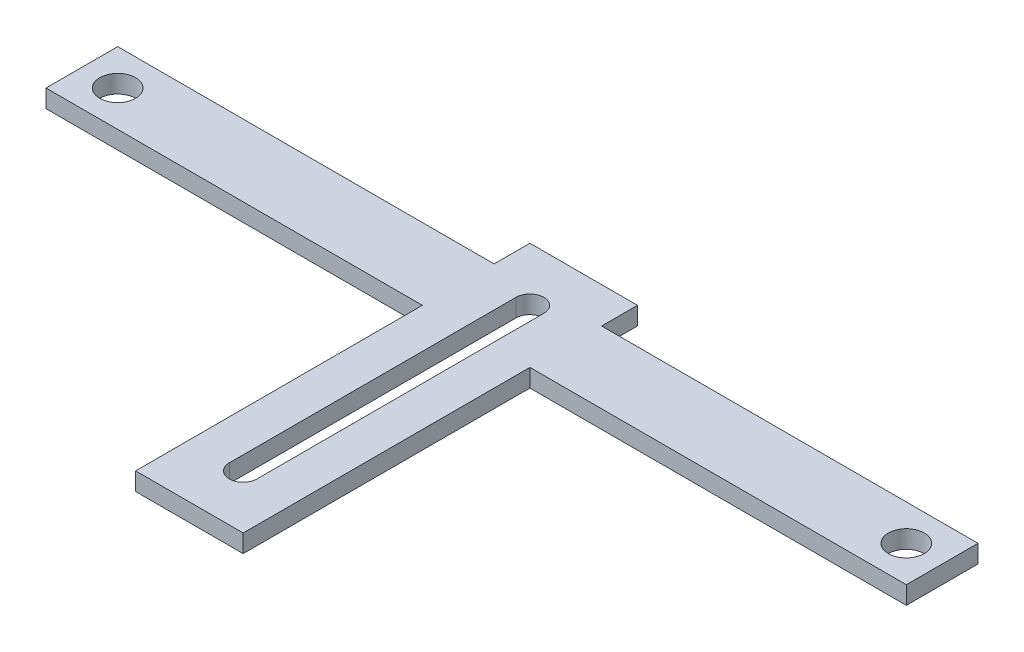
ISO-10303-21;
HEADER;
FILE_DESCRIPTION(('STEP AP214'),'2;1');
FILE_NAME('part.step','',(''),(''),'','','');
FILE_SCHEMA(('AUTOMOTIVE_DESIGN { 1 0 10303 214 1 1 1 1 }'));
ENDSEC;
DATA;
#1=APPLICATION_CONTEXT('core data for automotive mechanical design processes');
#2=APPLICATION_PROTOCOL_DEFINITION('international standard','automotive_design',2000,#1);
#3=PRODUCT_CONTEXT('',#1,'mechanical');
#4=PRODUCT('Part','Part','',(#3));
#5=PRODUCT_RELATED_PRODUCT_CATEGORY('part','',(#4));
#6=PRODUCT_DEFINITION_FORMATION('','',#4);
#7=PRODUCT_DEFINITION_CONTEXT('part definition',#1,'design');
#8=PRODUCT_DEFINITION('design','',#6,#7);
#9=PRODUCT_DEFINITION_SHAPE('','',#8);
#10=(LENGTH_UNIT() NAMED_UNIT(*) SI_UNIT(.MILLI.,.METRE.));
#11=(NAMED_UNIT(*) PLANE_ANGLE_UNIT() SI_UNIT($,.RADIAN.));
#12=(NAMED_UNIT(*) SI_UNIT($,.STERADIAN.) SOLID_ANGLE_UNIT());
#13=UNCERTAINTY_MEASURE_WITH_UNIT(LENGTH_MEASURE(1.E-05),#10,'distance_accuracy_value','');
#14=(GEOMETRIC_REPRESENTATION_CONTEXT(3) GLOBAL_UNCERTAINTY_ASSIGNED_CONTEXT((#13)) GLOBAL_UNIT_ASSIGNED_CONTEXT((#10,
#11,#12)) REPRESENTATION_CONTEXT('',''));
#15=CARTESIAN_POINT('',(0.,0.,0.));
#16=DIRECTION('',(0.,0.,1.));
#17=DIRECTION('',(1.,0.,0.));
#18=AXIS2_PLACEMENT_3D('',#15,#16,#17);
#19=CARTESIAN_POINT('',(-152.4,6.35,-12.7));
#20=DIRECTION('',(0.,0.,1.));
#21=DIRECTION('',(1.,0.,0.));
#22=AXIS2_PLACEMENT_3D('',#19,#20,#21);
#23=PLANE('',#22);
#24=DIRECTION('',(-1.,0.,0.));
#25=VECTOR('',#24,1.);
#26=CARTESIAN_POINT('',(-152.4,6.35,-12.7));
#27=LINE('',#26,#25);
#28=CARTESIAN_POINT('',(-19.0499999999999,6.35,-12.7));
#29=VERTEX_POINT('',#28);
#30=CARTESIAN_POINT('',(-152.4,6.35,-12.7));
#31=VERTEX_POINT('',#30);
#32=EDGE_CURVE('E238',#29,#31,#27,.T.);
#33=ORIENTED_EDGE('',*,*,#32,.F.);
#34=DIRECTION('',(0.,-1.,0.));
#35=VECTOR('',#34,1.);
#36=CARTESIAN_POINT('',(-19.0499999999999,6.35,-12.7));
#37=LINE('',#36,#35);
#38=CARTESIAN_POINT('',(-19.0499999999999,0.,-12.7));
#39=VERTEX_POINT('',#38);
#40=EDGE_CURVE('E219',#29,#39,#37,.T.);
#41=ORIENTED_EDGE('',*,*,#40,.T.);
#42=DIRECTION('',(-1.,0.,0.));
#43=VECTOR('',#42,1.);
#44=CARTESIAN_POINT('',(-152.4,0.,-12.7));
#45=LINE('',#44,#43);
#46=CARTESIAN_POINT('',(-152.4,0.,-12.7));
#47=VERTEX_POINT('',#46);
#48=EDGE_CURVE('E252',#39,#47,#45,.T.);
#49=ORIENTED_EDGE('',*,*,#48,.T.);
#50=DIRECTION('',(0.,-1.,0.));
#51=VECTOR('',#50,1.);
#52=CARTESIAN_POINT('',(-152.4,6.35,-12.7));
#53=LINE('',#52,#51);
#54=EDGE_CURVE('E266',#31,#47,#53,.T.);
#55=ORIENTED_EDGE('',*,*,#54,.F.);
#56=EDGE_LOOP('',(#33,#41,#49,#55));
#57=FACE_BOUND('',#56,.T.);
#58=ADVANCED_FACE('F33',(#57),#23,.F.);
#59=CARTESIAN_POINT('',(-152.4,6.35,12.7));
#60=DIRECTION('',(0.,0.,-1.));
#61=DIRECTION('',(-1.,0.,0.));
#62=AXIS2_PLACEMENT_3D('',#59,#60,#61);
#63=PLANE('',#62);
#64=DIRECTION('',(1.,0.,0.));
#65=VECTOR('',#64,1.);
#66=CARTESIAN_POINT('',(-152.4,0.,12.7));
#67=LINE('',#66,#65);
#68=CARTESIAN_POINT('',(-152.4,0.,12.7));
#69=VERTEX_POINT('',#68);
#70=CARTESIAN_POINT('',(-19.0499999999999,0.,12.7));
#71=VERTEX_POINT('',#70);
#72=EDGE_CURVE('E239',#69,#71,#67,.T.);
#73=ORIENTED_EDGE('',*,*,#72,.T.);
#74=DIRECTION('',(0.,1.,0.));
#75=VECTOR('',#74,1.);
#76=CARTESIAN_POINT('',(-19.0499999999999,6.35,12.7));
#77=LINE('',#76,#75);
#78=CARTESIAN_POINT('',(-19.0499999999999,6.35,12.7));
#79=VERTEX_POINT('',#78);
#80=EDGE_CURVE('E11',#71,#79,#77,.T.);
#81=ORIENTED_EDGE('',*,*,#80,.T.);
#82=DIRECTION('',(1.,0.,0.));
#83=VECTOR('',#82,1.);
#84=CARTESIAN_POINT('',(-152.4,6.35,12.7));
#85=LINE('',#84,#83);
#86=CARTESIAN_POINT('',(-152.4,6.35,12.7));
#87=VERTEX_POINT('',#86);
#88=EDGE_CURVE('E246',#87,#79,#85,.T.);
#89=ORIENTED_EDGE('',*,*,#88,.F.);
#90=DIRECTION('',(0.,-1.,0.));
#91=VECTOR('',#90,1.);
#92=CARTESIAN_POINT('',(-152.4,6.35,12.7));
#93=LINE('',#92,#91);
#94=EDGE_CURVE('E263',#87,#69,#93,.T.);
#95=ORIENTED_EDGE('',*,*,#94,.T.);
#96=EDGE_LOOP('',(#73,#81,#89,#95));
#97=FACE_BOUND('',#96,.T.);
#98=ADVANCED_FACE('F300',(#97),#63,.F.);
#99=CARTESIAN_POINT('',(0.,6.35,0.));
#100=DIRECTION('',(0.,-1.,0.));
#101=DIRECTION('',(0.,0.,-1.));
#102=AXIS2_PLACEMENT_3D('',#99,#100,#101);
#103=PLANE('',#102);
#104=DIRECTION('',(0.,0.,-1.));
#105=VECTOR('',#104,1.);
#106=CARTESIAN_POINT('',(4.92294056329001,6.35,95.25));
#107=LINE('',#106,#105);
#108=CARTESIAN_POINT('',(4.92294056329001,6.35,95.25));
#109=VERTEX_POINT('',#108);
#110=CARTESIAN_POINT('',(4.92294056329001,6.35,-6.35));
#111=VERTEX_POINT('',#110);
#112=EDGE_CURVE('E165',#109,#111,#107,.T.);
#113=ORIENTED_EDGE('',*,*,#112,.F.);
#114=CARTESIAN_POINT('',(0.,6.35,95.25));
#115=DIRECTION('',(0.,1.,0.));
#116=DIRECTION('',(0.,0.,1.));
#117=AXIS2_PLACEMENT_3D('',#114,#115,#116);
#118=CIRCLE('',#117,4.92294056329001);
#119=CARTESIAN_POINT('',(-4.92294056329001,6.35,95.25));
#120=VERTEX_POINT('',#119);
#121=EDGE_CURVE('E48',#120,#109,#118,.T.);
#122=ORIENTED_EDGE('',*,*,#121,.F.);
#123=DIRECTION('',(0.,0.,1.));
#124=VECTOR('',#123,1.);
#125=CARTESIAN_POINT('',(-4.92294056329001,6.35,95.25));
#126=LINE('',#125,#124);
#127=CARTESIAN_POINT('',(-4.92294056329001,6.35,-6.35));
#128=VERTEX_POINT('',#127);
#129=EDGE_CURVE('E158',#128,#120,#126,.T.);
#130=ORIENTED_EDGE('',*,*,#129,.F.);
#131=CARTESIAN_POINT('',(0.,6.35,-6.35));
#132=DIRECTION('',(0.,1.,0.));
#133=DIRECTION('',(0.,0.,1.));
#134=AXIS2_PLACEMENT_3D('',#131,#132,#133);
#135=CIRCLE('',#134,4.92294056329001);
#136=EDGE_CURVE('E172',#111,#128,#135,.T.);
#137=ORIENTED_EDGE('',*,*,#136,.F.);
#138=EDGE_LOOP('',(#113,#122,#130,#137));
#139=FACE_BOUND('',#138,.T.);
#140=CARTESIAN_POINT('',(152.4,6.35,-12.7));
#141=VERTEX_POINT('',#140);
#142=CARTESIAN_POINT('',(19.05,6.35,-12.7));
#143=VERTEX_POINT('',#142);
#144=EDGE_CURVE('E240',#141,#143,#27,.T.);
#145=ORIENTED_EDGE('',*,*,#144,.T.);
#146=DIRECTION('',(0.,0.,-1.));
#147=VECTOR('',#146,1.);
#148=CARTESIAN_POINT('',(19.0500000000001,6.35,12.7));
#149=LINE('',#148,#147);
#150=CARTESIAN_POINT('',(19.0500000000001,6.35,-25.4));
#151=VERTEX_POINT('',#150);
#152=EDGE_CURVE('E188',#143,#151,#149,.T.);
#153=ORIENTED_EDGE('',*,*,#152,.T.);
#154=DIRECTION('',(-1.,0.,0.));
#155=VECTOR('',#154,1.);
#156=CARTESIAN_POINT('',(-19.0499999999999,6.35,-25.4));
#157=LINE('',#156,#155);
#158=CARTESIAN_POINT('',(-19.0499999999999,6.35,-25.4));
#159=VERTEX_POINT('',#158);
#160=EDGE_CURVE('E152',#151,#159,#157,.T.);
#161=ORIENTED_EDGE('',*,*,#160,.T.);
#162=DIRECTION('',(0.,0.,1.));
#163=VECTOR('',#162,1.);
#164=CARTESIAN_POINT('',(-19.0499999999999,6.35,12.7));
#165=LINE('',#164,#163);
#166=EDGE_CURVE('E192',#159,#29,#165,.T.);
#167=ORIENTED_EDGE('',*,*,#166,.T.);
#168=ORIENTED_EDGE('',*,*,#32,.T.);
#169=DIRECTION('',(0.,0.,1.));
#170=VECTOR('',#169,1.);
#171=CARTESIAN_POINT('',(-152.4,6.35,12.7));
#172=LINE('',#171,#170);
#173=EDGE_CURVE('E243',#31,#87,#172,.T.);
#174=ORIENTED_EDGE('',*,*,#173,.T.);
#175=ORIENTED_EDGE('',*,*,#88,.T.);
#176=CARTESIAN_POINT('',(-19.0499999999999,6.35,114.3));
#177=VERTEX_POINT('',#176);
#178=EDGE_CURVE('E183',#79,#177,#165,.T.);
#179=ORIENTED_EDGE('',*,*,#178,.T.);
#180=DIRECTION('',(1.,0.,0.));
#181=VECTOR('',#180,1.);
#182=CARTESIAN_POINT('',(-19.0499999999999,6.35,114.3));
#183=LINE('',#182,#181);
#184=CARTESIAN_POINT('',(19.0500000000001,6.35,114.3));
#185=VERTEX_POINT('',#184);
#186=EDGE_CURVE('E189',#177,#185,#183,.T.);
#187=ORIENTED_EDGE('',*,*,#186,.T.);
#188=CARTESIAN_POINT('',(19.0500000000001,6.35,12.7));
#189=VERTEX_POINT('',#188);
#190=EDGE_CURVE('E184',#185,#189,#149,.T.);
#191=ORIENTED_EDGE('',*,*,#190,.T.);
#192=CARTESIAN_POINT('',(152.4,6.35,12.7));
#193=VERTEX_POINT('',#192);
#194=EDGE_CURVE('E245',#189,#193,#85,.T.);
#195=ORIENTED_EDGE('',*,*,#194,.T.);
#196=DIRECTION('',(0.,0.,-1.));
#197=VECTOR('',#196,1.);
#198=CARTESIAN_POINT('',(152.4,6.35,12.7));
#199=LINE('',#198,#197);
#200=EDGE_CURVE('E235',#193,#141,#199,.T.);
#201=ORIENTED_EDGE('',*,*,#200,.T.);
#202=EDGE_LOOP('',(#145,#153,#161,#167,#168,#174,#175,#179,#187,#191,#195,#201));
#203=FACE_BOUND('',#202,.T.);
#204=CARTESIAN_POINT('',(139.7,6.35,0.));
#205=DIRECTION('',(0.,1.,0.));
#206=DIRECTION('',(0.,0.,1.));
#207=AXIS2_PLACEMENT_3D('',#204,#205,#206);
#208=CIRCLE('',#207,6.35);
#209=CARTESIAN_POINT('',(139.7,6.35,6.34999999999999));
#210=VERTEX_POINT('',#209);
#211=EDGE_CURVE('E223',#210,#210,#208,.T.);
#212=ORIENTED_EDGE('',*,*,#211,.F.);
#213=EDGE_LOOP('',(#212));
#214=FACE_BOUND('',#213,.T.);
#215=CARTESIAN_POINT('',(-139.7,6.35,0.));
#216=DIRECTION('',(0.,1.,0.));
#217=DIRECTION('',(0.,0.,1.));
#218=AXIS2_PLACEMENT_3D('',#215,#216,#217);
#219=CIRCLE('',#218,6.35);
#220=CARTESIAN_POINT('',(-139.7,6.35,6.34999999999999));
#221=VERTEX_POINT('',#220);
#222=EDGE_CURVE('E229',#221,#221,#219,.T.);
#223=ORIENTED_EDGE('',*,*,#222,.F.);
#224=EDGE_LOOP('',(#223));
#225=FACE_BOUND('',#224,.T.);
#226=ADVANCED_FACE('F288',(#139,#203,#214,#225),#103,.F.);
#227=CARTESIAN_POINT('',(0.,0.,0.));
#228=DIRECTION('',(0.,-1.,0.));
#229=DIRECTION('',(0.,0.,-1.));
#230=AXIS2_PLACEMENT_3D('',#227,#228,#229);
#231=PLANE('',#230);
#232=CARTESIAN_POINT('',(0.,0.,95.25));
#233=DIRECTION('',(0.,-1.,0.));
#234=DIRECTION('',(0.,0.,-1.));
#235=AXIS2_PLACEMENT_3D('',#232,#233,#234);
#236=CIRCLE('',#235,4.92294056329001);
#237=CARTESIAN_POINT('',(-4.92294056329001,0.,95.25));
#238=VERTEX_POINT('',#237);
#239=CARTESIAN_POINT('',(4.92294056329001,0.,95.25));
#240=VERTEX_POINT('',#239);
#241=EDGE_CURVE('E156',#238,#240,#236,.F.);
#242=ORIENTED_EDGE('',*,*,#241,.T.);
#243=DIRECTION('',(0.,0.,-1.));
#244=VECTOR('',#243,1.);
#245=CARTESIAN_POINT('',(4.92294056329001,0.,95.25));
#246=LINE('',#245,#244);
#247=CARTESIAN_POINT('',(4.92294056329001,0.,-6.35));
#248=VERTEX_POINT('',#247);
#249=EDGE_CURVE('E145',#240,#248,#246,.T.);
#250=ORIENTED_EDGE('',*,*,#249,.T.);
#251=CARTESIAN_POINT('',(0.,0.,-6.35));
#252=DIRECTION('',(0.,-1.,0.));
#253=DIRECTION('',(0.,0.,-1.));
#254=AXIS2_PLACEMENT_3D('',#251,#252,#253);
#255=CIRCLE('',#254,4.92294056329001);
#256=CARTESIAN_POINT('',(-4.92294056329001,0.,-6.35));
#257=VERTEX_POINT('',#256);
#258=EDGE_CURVE('E167',#248,#257,#255,.F.);
#259=ORIENTED_EDGE('',*,*,#258,.T.);
#260=DIRECTION('',(0.,0.,1.));
#261=VECTOR('',#260,1.);
#262=CARTESIAN_POINT('',(-4.92294056329001,0.,95.25));
#263=LINE('',#262,#261);
#264=EDGE_CURVE('E163',#257,#238,#263,.T.);
#265=ORIENTED_EDGE('',*,*,#264,.T.);
#266=EDGE_LOOP('',(#242,#250,#259,#265));
#267=FACE_BOUND('',#266,.T.);
#268=CARTESIAN_POINT('',(19.05,0.,12.7));
#269=VERTEX_POINT('',#268);
#270=CARTESIAN_POINT('',(152.4,0.,12.7));
#271=VERTEX_POINT('',#270);
#272=EDGE_CURVE('E258',#269,#271,#67,.T.);
#273=ORIENTED_EDGE('',*,*,#272,.F.);
#274=DIRECTION('',(0.,0.,-1.));
#275=VECTOR('',#274,1.);
#276=CARTESIAN_POINT('',(19.0500000000001,0.,12.7));
#277=LINE('',#276,#275);
#278=CARTESIAN_POINT('',(19.0500000000001,0.,114.3));
#279=VERTEX_POINT('',#278);
#280=EDGE_CURVE('E203',#279,#269,#277,.T.);
#281=ORIENTED_EDGE('',*,*,#280,.F.);
#282=DIRECTION('',(1.,0.,0.));
#283=VECTOR('',#282,1.);
#284=CARTESIAN_POINT('',(-19.0499999999999,0.,114.3));
#285=LINE('',#284,#283);
#286=CARTESIAN_POINT('',(-19.0499999999999,0.,114.3));
#287=VERTEX_POINT('',#286);
#288=EDGE_CURVE('E206',#287,#279,#285,.T.);
#289=ORIENTED_EDGE('',*,*,#288,.F.);
#290=DIRECTION('',(0.,0.,1.));
#291=VECTOR('',#290,1.);
#292=CARTESIAN_POINT('',(-19.0499999999999,0.,12.7));
#293=LINE('',#292,#291);
#294=EDGE_CURVE('E187',#71,#287,#293,.T.);
#295=ORIENTED_EDGE('',*,*,#294,.F.);
#296=ORIENTED_EDGE('',*,*,#72,.F.);
#297=DIRECTION('',(0.,0.,1.));
#298=VECTOR('',#297,1.);
#299=CARTESIAN_POINT('',(-152.4,0.,12.7));
#300=LINE('',#299,#298);
#301=EDGE_CURVE('E256',#47,#69,#300,.T.);
#302=ORIENTED_EDGE('',*,*,#301,.F.);
#303=ORIENTED_EDGE('',*,*,#48,.F.);
#304=CARTESIAN_POINT('',(-19.0499999999999,0.,-25.4));
#305=VERTEX_POINT('',#304);
#306=EDGE_CURVE('E195',#305,#39,#293,.T.);
#307=ORIENTED_EDGE('',*,*,#306,.F.);
#308=DIRECTION('',(-1.,0.,0.));
#309=VECTOR('',#308,1.);
#310=CARTESIAN_POINT('',(-19.0499999999999,0.,-25.4));
#311=LINE('',#310,#309);
#312=CARTESIAN_POINT('',(19.0500000000001,0.,-25.4));
#313=VERTEX_POINT('',#312);
#314=EDGE_CURVE('E198',#313,#305,#311,.T.);
#315=ORIENTED_EDGE('',*,*,#314,.F.);
#316=CARTESIAN_POINT('',(19.0500000000001,0.,-12.7));
#317=VERTEX_POINT('',#316);
#318=EDGE_CURVE('E205',#317,#313,#277,.T.);
#319=ORIENTED_EDGE('',*,*,#318,.F.);
#320=CARTESIAN_POINT('',(152.4,0.,-12.7));
#321=VERTEX_POINT('',#320);
#322=EDGE_CURVE('E253',#321,#317,#45,.T.);
#323=ORIENTED_EDGE('',*,*,#322,.F.);
#324=DIRECTION('',(0.,0.,-1.));
#325=VECTOR('',#324,1.);
#326=CARTESIAN_POINT('',(152.4,0.,12.7));
#327=LINE('',#326,#325);
#328=EDGE_CURVE('E232',#271,#321,#327,.T.);
#329=ORIENTED_EDGE('',*,*,#328,.F.);
#330=EDGE_LOOP('',(#273,#281,#289,#295,#296,#302,#303,#307,#315,#319,#323,#329));
#331=FACE_BOUND('',#330,.T.);
#332=CARTESIAN_POINT('',(139.7,0.,0.));
#333=DIRECTION('',(0.,1.,0.));
#334=DIRECTION('',(0.,0.,1.));
#335=AXIS2_PLACEMENT_3D('',#332,#333,#334);
#336=CIRCLE('',#335,6.35);
#337=CARTESIAN_POINT('',(139.7,0.,6.34999999999999));
#338=VERTEX_POINT('',#337);
#339=EDGE_CURVE('E222',#338,#338,#336,.T.);
#340=ORIENTED_EDGE('',*,*,#339,.T.);
#341=EDGE_LOOP('',(#340));
#342=FACE_BOUND('',#341,.T.);
#343=CARTESIAN_POINT('',(-139.7,0.,0.));
#344=DIRECTION('',(0.,1.,0.));
#345=DIRECTION('',(0.,0.,1.));
#346=AXIS2_PLACEMENT_3D('',#343,#344,#345);
#347=CIRCLE('',#346,6.35);
#348=CARTESIAN_POINT('',(-139.7,0.,6.34999999999999));
#349=VERTEX_POINT('',#348);
#350=EDGE_CURVE('E226',#349,#349,#347,.T.);
#351=ORIENTED_EDGE('',*,*,#350,.T.);
#352=EDGE_LOOP('',(#351));
#353=FACE_BOUND('',#352,.T.);
#354=ADVANCED_FACE('F161',(#267,#331,#342,#353),#231,.T.);
#355=CARTESIAN_POINT('',(152.4,6.35,12.7));
#356=DIRECTION('',(-1.,0.,0.));
#357=DIRECTION('',(0.,0.,1.));
#358=AXIS2_PLACEMENT_3D('',#355,#356,#357);
#359=PLANE('',#358);
#360=ORIENTED_EDGE('',*,*,#328,.T.);
#361=DIRECTION('',(0.,-1.,0.));
#362=VECTOR('',#361,1.);
#363=CARTESIAN_POINT('',(152.4,6.35,-12.7));
#364=LINE('',#363,#362);
#365=EDGE_CURVE('E269',#141,#321,#364,.T.);
#366=ORIENTED_EDGE('',*,*,#365,.F.);
#367=ORIENTED_EDGE('',*,*,#200,.F.);
#368=DIRECTION('',(0.,-1.,0.));
#369=VECTOR('',#368,1.);
#370=CARTESIAN_POINT('',(152.4,6.35,12.7));
#371=LINE('',#370,#369);
#372=EDGE_CURVE('E249',#193,#271,#371,.T.);
#373=ORIENTED_EDGE('',*,*,#372,.T.);
#374=EDGE_LOOP('',(#360,#366,#367,#373));
#375=FACE_BOUND('',#374,.T.);
#376=ADVANCED_FACE('F35',(#375),#359,.F.);
#377=ORIENTED_EDGE('',*,*,#322,.T.);
#378=DIRECTION('',(0.,1.,0.));
#379=VECTOR('',#378,1.);
#380=CARTESIAN_POINT('',(19.0500000000001,6.35,-12.7));
#381=LINE('',#380,#379);
#382=EDGE_CURVE('E211',#317,#143,#381,.T.);
#383=ORIENTED_EDGE('',*,*,#382,.T.);
#384=ORIENTED_EDGE('',*,*,#144,.F.);
#385=ORIENTED_EDGE('',*,*,#365,.T.);
#386=EDGE_LOOP('',(#377,#383,#384,#385));
#387=FACE_BOUND('',#386,.T.);
#388=ADVANCED_FACE('F321',(#387),#23,.F.);
#389=CARTESIAN_POINT('',(-152.4,6.35,12.7));
#390=DIRECTION('',(1.,0.,0.));
#391=DIRECTION('',(0.,0.,-1.));
#392=AXIS2_PLACEMENT_3D('',#389,#390,#391);
#393=PLANE('',#392);
#394=ORIENTED_EDGE('',*,*,#301,.T.);
#395=ORIENTED_EDGE('',*,*,#94,.F.);
#396=ORIENTED_EDGE('',*,*,#173,.F.);
#397=ORIENTED_EDGE('',*,*,#54,.T.);
#398=EDGE_LOOP('',(#394,#395,#396,#397));
#399=FACE_BOUND('',#398,.T.);
#400=ADVANCED_FACE('F305',(#399),#393,.F.);
#401=ORIENTED_EDGE('',*,*,#194,.F.);
#402=DIRECTION('',(0.,-1.,0.));
#403=VECTOR('',#402,1.);
#404=CARTESIAN_POINT('',(19.0500000000001,6.35,12.7));
#405=LINE('',#404,#403);
#406=EDGE_CURVE('E41',#189,#269,#405,.T.);
#407=ORIENTED_EDGE('',*,*,#406,.T.);
#408=ORIENTED_EDGE('',*,*,#272,.T.);
#409=ORIENTED_EDGE('',*,*,#372,.F.);
#410=EDGE_LOOP('',(#401,#407,#408,#409));
#411=FACE_BOUND('',#410,.T.);
#412=ADVANCED_FACE('F275',(#411),#63,.F.);
#413=CARTESIAN_POINT('',(-139.7,6.35,0.));
#414=DIRECTION('',(0.,-1.,0.));
#415=DIRECTION('',(0.,0.,-1.));
#416=AXIS2_PLACEMENT_3D('',#413,#414,#415);
#417=CYLINDRICAL_SURFACE('',#416,6.35);
#418=ORIENTED_EDGE('',*,*,#222,.T.);
#419=EDGE_LOOP('',(#418));
#420=FACE_BOUND('',#419,.T.);
#421=ORIENTED_EDGE('',*,*,#350,.F.);
#422=EDGE_LOOP('',(#421));
#423=FACE_BOUND('',#422,.T.);
#424=ADVANCED_FACE('F358',(#420,#423),#417,.F.);
#425=CARTESIAN_POINT('',(139.7,6.35,0.));
#426=DIRECTION('',(0.,-1.,0.));
#427=DIRECTION('',(0.,0.,-1.));
#428=AXIS2_PLACEMENT_3D('',#425,#426,#427);
#429=CYLINDRICAL_SURFACE('',#428,6.35);
#430=ORIENTED_EDGE('',*,*,#211,.T.);
#431=EDGE_LOOP('',(#430));
#432=FACE_BOUND('',#431,.T.);
#433=ORIENTED_EDGE('',*,*,#339,.F.);
#434=EDGE_LOOP('',(#433));
#435=FACE_BOUND('',#434,.T.);
#436=ADVANCED_FACE('F363',(#432,#435),#429,.F.);
#437=CARTESIAN_POINT('',(-19.0499999999999,-144.802278987591,114.3));
#438=DIRECTION('',(0.,0.,1.));
#439=DIRECTION('',(1.,0.,0.));
#440=AXIS2_PLACEMENT_3D('',#437,#438,#439);
#441=PLANE('',#440);
#442=DIRECTION('',(0.,1.,0.));
#443=VECTOR('',#442,1.);
#444=CARTESIAN_POINT('',(-19.0499999999999,-144.802278987591,114.3));
#445=LINE('',#444,#443);
#446=EDGE_CURVE('E197',#287,#177,#445,.T.);
#447=ORIENTED_EDGE('',*,*,#446,.F.);
#448=ORIENTED_EDGE('',*,*,#288,.T.);
#449=DIRECTION('',(0.,1.,0.));
#450=VECTOR('',#449,1.);
#451=CARTESIAN_POINT('',(19.0500000000001,-144.802278987591,114.3));
#452=LINE('',#451,#450);
#453=EDGE_CURVE('E209',#279,#185,#452,.T.);
#454=ORIENTED_EDGE('',*,*,#453,.T.);
#455=ORIENTED_EDGE('',*,*,#186,.F.);
#456=EDGE_LOOP('',(#447,#448,#454,#455));
#457=FACE_BOUND('',#456,.T.);
#458=ADVANCED_FACE('F294',(#457),#441,.T.);
#459=CARTESIAN_POINT('',(-19.0499999999999,-144.802278987591,12.7));
#460=DIRECTION('',(-1.,0.,0.));
#461=DIRECTION('',(0.,0.,1.));
#462=AXIS2_PLACEMENT_3D('',#459,#460,#461);
#463=PLANE('',#462);
#464=ORIENTED_EDGE('',*,*,#80,.F.);
#465=ORIENTED_EDGE('',*,*,#294,.T.);
#466=ORIENTED_EDGE('',*,*,#446,.T.);
#467=ORIENTED_EDGE('',*,*,#178,.F.);
#468=EDGE_LOOP('',(#464,#465,#466,#467));
#469=FACE_BOUND('',#468,.T.);
#470=ADVANCED_FACE('F331',(#469),#463,.T.);
#471=CARTESIAN_POINT('',(19.0500000000001,-144.802278987591,12.7));
#472=DIRECTION('',(1.,0.,0.));
#473=DIRECTION('',(0.,0.,-1.));
#474=AXIS2_PLACEMENT_3D('',#471,#472,#473);
#475=PLANE('',#474);
#476=ORIENTED_EDGE('',*,*,#406,.F.);
#477=ORIENTED_EDGE('',*,*,#190,.F.);
#478=ORIENTED_EDGE('',*,*,#453,.F.);
#479=ORIENTED_EDGE('',*,*,#280,.T.);
#480=EDGE_LOOP('',(#476,#477,#478,#479));
#481=FACE_BOUND('',#480,.T.);
#482=ADVANCED_FACE('F291',(#481),#475,.T.);
#483=ORIENTED_EDGE('',*,*,#40,.F.);
#484=ORIENTED_EDGE('',*,*,#166,.F.);
#485=DIRECTION('',(0.,1.,0.));
#486=VECTOR('',#485,1.);
#487=CARTESIAN_POINT('',(-19.0499999999999,-144.802278987591,-25.4));
#488=LINE('',#487,#486);
#489=EDGE_CURVE('E201',#305,#159,#488,.T.);
#490=ORIENTED_EDGE('',*,*,#489,.F.);
#491=ORIENTED_EDGE('',*,*,#306,.T.);
#492=EDGE_LOOP('',(#483,#484,#490,#491));
#493=FACE_BOUND('',#492,.T.);
#494=ADVANCED_FACE('F313',(#493),#463,.T.);
#495=ORIENTED_EDGE('',*,*,#382,.F.);
#496=ORIENTED_EDGE('',*,*,#318,.T.);
#497=DIRECTION('',(0.,1.,0.));
#498=VECTOR('',#497,1.);
#499=CARTESIAN_POINT('',(19.0500000000001,-144.802278987591,-25.4));
#500=LINE('',#499,#498);
#501=EDGE_CURVE('E202',#313,#151,#500,.T.);
#502=ORIENTED_EDGE('',*,*,#501,.T.);
#503=ORIENTED_EDGE('',*,*,#152,.F.);
#504=EDGE_LOOP('',(#495,#496,#502,#503));
#505=FACE_BOUND('',#504,.T.);
#506=ADVANCED_FACE('F322',(#505),#475,.T.);
#507=CARTESIAN_POINT('',(-19.0499999999999,-144.802278987591,-25.4));
#508=DIRECTION('',(0.,0.,-1.));
#509=DIRECTION('',(-1.,0.,0.));
#510=AXIS2_PLACEMENT_3D('',#507,#508,#509);
#511=PLANE('',#510);
#512=ORIENTED_EDGE('',*,*,#501,.F.);
#513=ORIENTED_EDGE('',*,*,#314,.T.);
#514=ORIENTED_EDGE('',*,*,#489,.T.);
#515=ORIENTED_EDGE('',*,*,#160,.F.);
#516=EDGE_LOOP('',(#512,#513,#514,#515));
#517=FACE_BOUND('',#516,.T.);
#518=ADVANCED_FACE('F318',(#517),#511,.T.);
#519=CARTESIAN_POINT('',(0.,-0.00100000000005564,95.25));
#520=DIRECTION('',(0.,1.,0.));
#521=DIRECTION('',(0.,0.,1.));
#522=AXIS2_PLACEMENT_3D('',#519,#520,#521);
#523=CYLINDRICAL_SURFACE('',#522,4.92294056329001);
#524=DIRECTION('',(0.,1.,0.));
#525=VECTOR('',#524,1.);
#526=CARTESIAN_POINT('',(-4.92294056329001,-0.00100000000005564,95.25));
#527=LINE('',#526,#525);
#528=EDGE_CURVE('E153',#238,#120,#527,.T.);
#529=ORIENTED_EDGE('',*,*,#528,.T.);
#530=ORIENTED_EDGE('',*,*,#121,.T.);
#531=DIRECTION('',(0.,1.,0.));
#532=VECTOR('',#531,1.);
#533=CARTESIAN_POINT('',(4.92294056329001,-0.00100000000005564,95.25));
#534=LINE('',#533,#532);
#535=EDGE_CURVE('E147',#240,#109,#534,.T.);
#536=ORIENTED_EDGE('',*,*,#535,.F.);
#537=ORIENTED_EDGE('',*,*,#241,.F.);
#538=EDGE_LOOP('',(#529,#530,#536,#537));
#539=FACE_BOUND('',#538,.T.);
#540=ADVANCED_FACE('F155',(#539),#523,.F.);
#541=CARTESIAN_POINT('',(-4.92294056329001,-0.00100000000005564,95.25));
#542=DIRECTION('',(-1.,0.,0.));
#543=DIRECTION('',(0.,0.,1.));
#544=AXIS2_PLACEMENT_3D('',#541,#542,#543);
#545=PLANE('',#544);
#546=DIRECTION('',(0.,1.,0.));
#547=VECTOR('',#546,1.);
#548=CARTESIAN_POINT('',(-4.92294056329001,-0.00100000000005564,-6.35));
#549=LINE('',#548,#547);
#550=EDGE_CURVE('E178',#257,#128,#549,.T.);
#551=ORIENTED_EDGE('',*,*,#550,.T.);
#552=ORIENTED_EDGE('',*,*,#129,.T.);
#553=ORIENTED_EDGE('',*,*,#528,.F.);
#554=ORIENTED_EDGE('',*,*,#264,.F.);
#555=EDGE_LOOP('',(#551,#552,#553,#554));
#556=FACE_BOUND('',#555,.T.);
#557=ADVANCED_FACE('F418',(#556),#545,.F.);
#558=CARTESIAN_POINT('',(0.,-0.00100000000005564,-6.35));
#559=DIRECTION('',(0.,1.,0.));
#560=DIRECTION('',(0.,0.,1.));
#561=AXIS2_PLACEMENT_3D('',#558,#559,#560);
#562=CYLINDRICAL_SURFACE('',#561,4.92294056329001);
#563=DIRECTION('',(0.,1.,0.));
#564=VECTOR('',#563,1.);
#565=CARTESIAN_POINT('',(4.92294056329001,-0.00100000000005564,-6.35));
#566=LINE('',#565,#564);
#567=EDGE_CURVE('E56',#248,#111,#566,.T.);
#568=ORIENTED_EDGE('',*,*,#567,.T.);
#569=ORIENTED_EDGE('',*,*,#136,.T.);
#570=ORIENTED_EDGE('',*,*,#550,.F.);
#571=ORIENTED_EDGE('',*,*,#258,.F.);
#572=EDGE_LOOP('',(#568,#569,#570,#571));
#573=FACE_BOUND('',#572,.T.);
#574=ADVANCED_FACE('F427',(#573),#562,.F.);
#575=CARTESIAN_POINT('',(4.92294056329001,-0.00100000000005564,95.25));
#576=DIRECTION('',(1.,0.,0.));
#577=DIRECTION('',(0.,0.,-1.));
#578=AXIS2_PLACEMENT_3D('',#575,#576,#577);
#579=PLANE('',#578);
#580=ORIENTED_EDGE('',*,*,#535,.T.);
#581=ORIENTED_EDGE('',*,*,#112,.T.);
#582=ORIENTED_EDGE('',*,*,#567,.F.);
#583=ORIENTED_EDGE('',*,*,#249,.F.);
#584=EDGE_LOOP('',(#580,#581,#582,#583));
#585=FACE_BOUND('',#584,.T.);
#586=ADVANCED_FACE('F146',(#585),#579,.F.);
#587=CLOSED_SHELL('',(#58,#98,#226,#354,#376,#388,#400,#412,#424,#436,#458,#470,#482,#494,#506,
#518,#540,#557,#574,#586));
#588=MANIFOLD_SOLID_BREP('B2',#587);
#589=ADVANCED_BREP_SHAPE_REPRESENTATION('',(#18,#588),#14);
#590=SHAPE_DEFINITION_REPRESENTATION(#9,#589);
ENDSEC;
END-ISO-10303-21;
